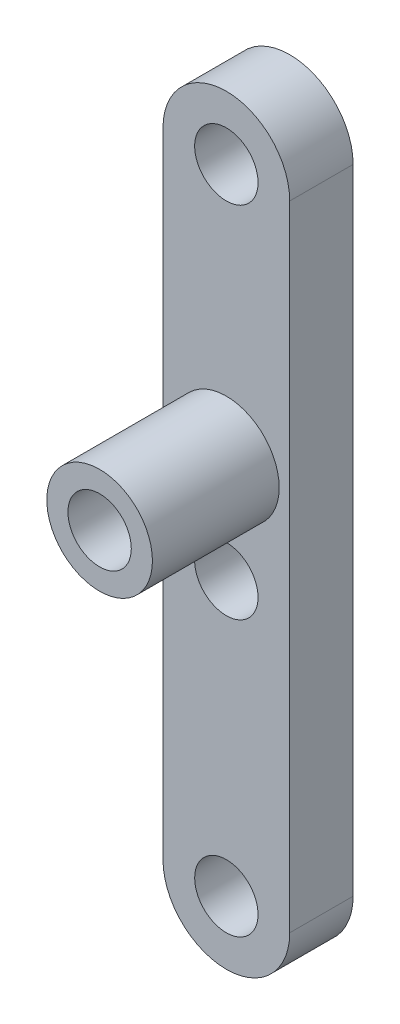
ISO-10303-21;
HEADER;
FILE_DESCRIPTION(('STEP AP214'),'2;1');
FILE_NAME('part.step','',(''),(''),'','','');
FILE_SCHEMA(('AUTOMOTIVE_DESIGN { 1 0 10303 214 1 1 1 1 }'));
ENDSEC;
DATA;
#1=APPLICATION_CONTEXT('core data for automotive mechanical design processes');
#2=APPLICATION_PROTOCOL_DEFINITION('international standard','automotive_design',2000,#1);
#3=PRODUCT_CONTEXT('',#1,'mechanical');
#4=PRODUCT('Part','Part','',(#3));
#5=PRODUCT_RELATED_PRODUCT_CATEGORY('part','',(#4));
#6=PRODUCT_DEFINITION_FORMATION('','',#4);
#7=PRODUCT_DEFINITION_CONTEXT('part definition',#1,'design');
#8=PRODUCT_DEFINITION('design','',#6,#7);
#9=PRODUCT_DEFINITION_SHAPE('','',#8);
#10=(LENGTH_UNIT() NAMED_UNIT(*) SI_UNIT(.MILLI.,.METRE.));
#11=(NAMED_UNIT(*) PLANE_ANGLE_UNIT() SI_UNIT($,.RADIAN.));
#12=(NAMED_UNIT(*) SI_UNIT($,.STERADIAN.) SOLID_ANGLE_UNIT());
#13=UNCERTAINTY_MEASURE_WITH_UNIT(LENGTH_MEASURE(1.E-05),#10,'distance_accuracy_value','');
#14=(GEOMETRIC_REPRESENTATION_CONTEXT(3) GLOBAL_UNCERTAINTY_ASSIGNED_CONTEXT((#13)) GLOBAL_UNIT_ASSIGNED_CONTEXT((#10,
#11,#12)) REPRESENTATION_CONTEXT('',''));
#15=CARTESIAN_POINT('',(0.,0.,0.));
#16=DIRECTION('',(0.,0.,1.));
#17=DIRECTION('',(1.,0.,0.));
#18=AXIS2_PLACEMENT_3D('',#15,#16,#17);
#19=CARTESIAN_POINT('',(0.,-12.,6.));
#20=DIRECTION('',(0.,0.,-1.));
#21=DIRECTION('',(1.,0.,0.));
#22=AXIS2_PLACEMENT_3D('',#19,#20,#21);
#23=CYLINDRICAL_SURFACE('',#22,2.5);
#24=CARTESIAN_POINT('',(0.,-12.,6.));
#25=DIRECTION('',(0.,0.,1.));
#26=DIRECTION('',(1.,0.,0.));
#27=AXIS2_PLACEMENT_3D('',#24,#25,#26);
#28=CIRCLE('',#27,2.5);
#29=CARTESIAN_POINT('',(2.5,-12.,6.));
#30=VERTEX_POINT('',#29);
#31=EDGE_CURVE('E11',#30,#30,#28,.T.);
#32=ORIENTED_EDGE('',*,*,#31,.F.);
#33=EDGE_LOOP('',(#32));
#34=FACE_BOUND('',#33,.T.);
#35=CARTESIAN_POINT('',(0.,-12.,0.));
#36=DIRECTION('',(0.,0.,1.));
#37=DIRECTION('',(1.,0.,0.));
#38=AXIS2_PLACEMENT_3D('',#35,#36,#37);
#39=CIRCLE('',#38,2.5);
#40=CARTESIAN_POINT('',(2.5,-12.,0.));
#41=VERTEX_POINT('',#40);
#42=EDGE_CURVE('E46',#41,#41,#39,.T.);
#43=ORIENTED_EDGE('',*,*,#42,.T.);
#44=EDGE_LOOP('',(#43));
#45=FACE_BOUND('',#44,.T.);
#46=ADVANCED_FACE('F43',(#34,#45),#23,.T.);
#47=CARTESIAN_POINT('',(0.,-12.,6.));
#48=DIRECTION('',(0.,0.,-1.));
#49=DIRECTION('',(1.,0.,0.));
#50=AXIS2_PLACEMENT_3D('',#47,#48,#49);
#51=PLANE('',#50);
#52=CARTESIAN_POINT('',(0.,-12.,6.));
#53=DIRECTION('',(0.,0.,1.));
#54=DIRECTION('',(1.,0.,0.));
#55=AXIS2_PLACEMENT_3D('',#52,#53,#54);
#56=CIRCLE('',#55,1.5);
#57=CARTESIAN_POINT('',(1.5,-12.,6.));
#58=VERTEX_POINT('',#57);
#59=EDGE_CURVE('E53',#58,#58,#56,.T.);
#60=ORIENTED_EDGE('',*,*,#59,.F.);
#61=EDGE_LOOP('',(#60));
#62=FACE_BOUND('',#61,.T.);
#63=ORIENTED_EDGE('',*,*,#31,.T.);
#64=EDGE_LOOP('',(#63));
#65=FACE_BOUND('',#64,.T.);
#66=ADVANCED_FACE('F64',(#62,#65),#51,.F.);
#67=CARTESIAN_POINT('',(0.,-12.,0.));
#68=DIRECTION('',(0.,0.,-1.));
#69=DIRECTION('',(1.,0.,0.));
#70=AXIS2_PLACEMENT_3D('',#67,#68,#69);
#71=PLANE('',#70);
#72=CARTESIAN_POINT('',(0.,-12.,0.));
#73=DIRECTION('',(0.,0.,1.));
#74=DIRECTION('',(1.,0.,0.));
#75=AXIS2_PLACEMENT_3D('',#72,#73,#74);
#76=CIRCLE('',#75,1.5);
#77=CARTESIAN_POINT('',(1.5,-12.,0.));
#78=VERTEX_POINT('',#77);
#79=EDGE_CURVE('E55',#78,#78,#76,.T.);
#80=ORIENTED_EDGE('',*,*,#79,.T.);
#81=EDGE_LOOP('',(#80));
#82=FACE_BOUND('',#81,.T.);
#83=ORIENTED_EDGE('',*,*,#42,.F.);
#84=EDGE_LOOP('',(#83));
#85=FACE_BOUND('',#84,.T.);
#86=ADVANCED_FACE('F66',(#82,#85),#71,.T.);
#87=CARTESIAN_POINT('',(0.,-12.,6.));
#88=DIRECTION('',(0.,0.,-1.));
#89=DIRECTION('',(1.,0.,0.));
#90=AXIS2_PLACEMENT_3D('',#87,#88,#89);
#91=CYLINDRICAL_SURFACE('',#90,1.5);
#92=ORIENTED_EDGE('',*,*,#59,.T.);
#93=EDGE_LOOP('',(#92));
#94=FACE_BOUND('',#93,.T.);
#95=ORIENTED_EDGE('',*,*,#79,.F.);
#96=EDGE_LOOP('',(#95));
#97=FACE_BOUND('',#96,.T.);
#98=ADVANCED_FACE('F61',(#94,#97),#91,.F.);
#99=CLOSED_SHELL('',(#46,#66,#86,#98));
#100=MANIFOLD_SOLID_BREP('B2',#99);
#101=CARTESIAN_POINT('',(0.,0.,-3.));
#102=DIRECTION('',(0.,0.,-1.));
#103=DIRECTION('',(1.,0.,0.));
#104=AXIS2_PLACEMENT_3D('',#101,#102,#103);
#105=PLANE('',#104);
#106=CARTESIAN_POINT('',(0.,-17.,-3.));
#107=DIRECTION('',(0.,0.,1.));
#108=DIRECTION('',(1.,0.,0.));
#109=AXIS2_PLACEMENT_3D('',#106,#107,#108);
#110=CIRCLE('',#109,1.5);
#111=CARTESIAN_POINT('',(1.5,-17.,-3.));
#112=VERTEX_POINT('',#111);
#113=EDGE_CURVE('E190',#112,#112,#110,.T.);
#114=ORIENTED_EDGE('',*,*,#113,.T.);
#115=EDGE_LOOP('',(#114));
#116=FACE_BOUND('',#115,.T.);
#117=CARTESIAN_POINT('',(0.,0.,-3.));
#118=DIRECTION('',(0.,0.,1.));
#119=DIRECTION('',(1.,0.,0.));
#120=AXIS2_PLACEMENT_3D('',#117,#118,#119);
#121=CIRCLE('',#120,1.5);
#122=CARTESIAN_POINT('',(1.5,0.,-3.));
#123=VERTEX_POINT('',#122);
#124=EDGE_CURVE('E173',#123,#123,#121,.T.);
#125=ORIENTED_EDGE('',*,*,#124,.T.);
#126=EDGE_LOOP('',(#125));
#127=FACE_BOUND('',#126,.T.);
#128=CARTESIAN_POINT('',(0.,0.,-3.));
#129=DIRECTION('',(0.,0.,1.));
#130=DIRECTION('',(1.,0.,0.));
#131=AXIS2_PLACEMENT_3D('',#128,#129,#130);
#132=CIRCLE('',#131,3.);
#133=CARTESIAN_POINT('',(3.,0.,-3.));
#134=VERTEX_POINT('',#133);
#135=CARTESIAN_POINT('',(-3.,0.,-3.));
#136=VERTEX_POINT('',#135);
#137=EDGE_CURVE('E161',#134,#136,#132,.T.);
#138=ORIENTED_EDGE('',*,*,#137,.F.);
#139=DIRECTION('',(0.,1.,0.));
#140=VECTOR('',#139,1.);
#141=CARTESIAN_POINT('',(3.,0.,-3.));
#142=LINE('',#141,#140);
#143=CARTESIAN_POINT('',(3.,-30.,-3.));
#144=VERTEX_POINT('',#143);
#145=EDGE_CURVE('E164',#144,#134,#142,.T.);
#146=ORIENTED_EDGE('',*,*,#145,.F.);
#147=CARTESIAN_POINT('',(0.,-30.,-3.));
#148=DIRECTION('',(0.,0.,1.));
#149=DIRECTION('',(-1.,0.,0.));
#150=AXIS2_PLACEMENT_3D('',#147,#148,#149);
#151=CIRCLE('',#150,3.);
#152=CARTESIAN_POINT('',(-3.,-30.,-3.));
#153=VERTEX_POINT('',#152);
#154=EDGE_CURVE('E152',#153,#144,#151,.T.);
#155=ORIENTED_EDGE('',*,*,#154,.F.);
#156=DIRECTION('',(0.,-1.,0.));
#157=VECTOR('',#156,1.);
#158=CARTESIAN_POINT('',(-3.,0.,-3.));
#159=LINE('',#158,#157);
#160=EDGE_CURVE('E157',#136,#153,#159,.T.);
#161=ORIENTED_EDGE('',*,*,#160,.F.);
#162=EDGE_LOOP('',(#138,#146,#155,#161));
#163=FACE_BOUND('',#162,.T.);
#164=CARTESIAN_POINT('',(0.,-30.,-3.));
#165=DIRECTION('',(0.,0.,1.));
#166=DIRECTION('',(-1.,0.,0.));
#167=AXIS2_PLACEMENT_3D('',#164,#165,#166);
#168=CIRCLE('',#167,1.5);
#169=CARTESIAN_POINT('',(-1.5,-30.,-3.));
#170=VERTEX_POINT('',#169);
#171=EDGE_CURVE('E184',#170,#170,#168,.T.);
#172=ORIENTED_EDGE('',*,*,#171,.T.);
#173=EDGE_LOOP('',(#172));
#174=FACE_BOUND('',#173,.T.);
#175=CARTESIAN_POINT('',(0.,-12.,-3.));
#176=DIRECTION('',(0.,0.,1.));
#177=DIRECTION('',(1.,0.,0.));
#178=AXIS2_PLACEMENT_3D('',#175,#176,#177);
#179=CIRCLE('',#178,1.5);
#180=CARTESIAN_POINT('',(1.5,-12.,-3.));
#181=VERTEX_POINT('',#180);
#182=EDGE_CURVE('E196',#181,#181,#179,.T.);
#183=ORIENTED_EDGE('',*,*,#182,.T.);
#184=EDGE_LOOP('',(#183));
#185=FACE_BOUND('',#184,.T.);
#186=ADVANCED_FACE('F105',(#116,#127,#163,#174,#185),#105,.T.);
#187=CARTESIAN_POINT('',(0.,0.,0.));
#188=DIRECTION('',(0.,0.,-1.));
#189=DIRECTION('',(1.,0.,0.));
#190=AXIS2_PLACEMENT_3D('',#187,#188,#189);
#191=PLANE('',#190);
#192=CARTESIAN_POINT('',(0.,0.,0.));
#193=DIRECTION('',(0.,0.,1.));
#194=DIRECTION('',(1.,0.,0.));
#195=AXIS2_PLACEMENT_3D('',#192,#193,#194);
#196=CIRCLE('',#195,3.);
#197=CARTESIAN_POINT('',(3.,0.,0.));
#198=VERTEX_POINT('',#197);
#199=CARTESIAN_POINT('',(-3.,0.,0.));
#200=VERTEX_POINT('',#199);
#201=EDGE_CURVE('E169',#198,#200,#196,.T.);
#202=ORIENTED_EDGE('',*,*,#201,.T.);
#203=DIRECTION('',(0.,-1.,0.));
#204=VECTOR('',#203,1.);
#205=CARTESIAN_POINT('',(-3.,0.,0.));
#206=LINE('',#205,#204);
#207=CARTESIAN_POINT('',(-3.,-30.,0.));
#208=VERTEX_POINT('',#207);
#209=EDGE_CURVE('E172',#200,#208,#206,.T.);
#210=ORIENTED_EDGE('',*,*,#209,.T.);
#211=CARTESIAN_POINT('',(0.,-30.,0.));
#212=DIRECTION('',(0.,0.,1.));
#213=DIRECTION('',(-1.,0.,0.));
#214=AXIS2_PLACEMENT_3D('',#211,#212,#213);
#215=CIRCLE('',#214,3.);
#216=CARTESIAN_POINT('',(3.,-30.,0.));
#217=VERTEX_POINT('',#216);
#218=EDGE_CURVE('E155',#208,#217,#215,.T.);
#219=ORIENTED_EDGE('',*,*,#218,.T.);
#220=DIRECTION('',(0.,1.,0.));
#221=VECTOR('',#220,1.);
#222=CARTESIAN_POINT('',(3.,0.,0.));
#223=LINE('',#222,#221);
#224=EDGE_CURVE('E176',#217,#198,#223,.T.);
#225=ORIENTED_EDGE('',*,*,#224,.T.);
#226=EDGE_LOOP('',(#202,#210,#219,#225));
#227=FACE_BOUND('',#226,.T.);
#228=CARTESIAN_POINT('',(0.,0.,0.));
#229=DIRECTION('',(0.,0.,1.));
#230=DIRECTION('',(1.,0.,0.));
#231=AXIS2_PLACEMENT_3D('',#228,#229,#230);
#232=CIRCLE('',#231,1.5);
#233=CARTESIAN_POINT('',(1.5,0.,0.));
#234=VERTEX_POINT('',#233);
#235=EDGE_CURVE('E181',#234,#234,#232,.T.);
#236=ORIENTED_EDGE('',*,*,#235,.F.);
#237=EDGE_LOOP('',(#236));
#238=FACE_BOUND('',#237,.T.);
#239=CARTESIAN_POINT('',(0.,-30.,0.));
#240=DIRECTION('',(0.,0.,1.));
#241=DIRECTION('',(-1.,0.,0.));
#242=AXIS2_PLACEMENT_3D('',#239,#240,#241);
#243=CIRCLE('',#242,1.5);
#244=CARTESIAN_POINT('',(-1.5,-30.,0.));
#245=VERTEX_POINT('',#244);
#246=EDGE_CURVE('E187',#245,#245,#243,.T.);
#247=ORIENTED_EDGE('',*,*,#246,.F.);
#248=EDGE_LOOP('',(#247));
#249=FACE_BOUND('',#248,.T.);
#250=CARTESIAN_POINT('',(0.,-17.,0.));
#251=DIRECTION('',(0.,0.,1.));
#252=DIRECTION('',(1.,0.,0.));
#253=AXIS2_PLACEMENT_3D('',#250,#251,#252);
#254=CIRCLE('',#253,1.5);
#255=CARTESIAN_POINT('',(1.5,-17.,0.));
#256=VERTEX_POINT('',#255);
#257=EDGE_CURVE('E193',#256,#256,#254,.T.);
#258=ORIENTED_EDGE('',*,*,#257,.F.);
#259=EDGE_LOOP('',(#258));
#260=FACE_BOUND('',#259,.T.);
#261=CARTESIAN_POINT('',(0.,-12.,0.));
#262=DIRECTION('',(0.,0.,1.));
#263=DIRECTION('',(1.,0.,0.));
#264=AXIS2_PLACEMENT_3D('',#261,#262,#263);
#265=CIRCLE('',#264,1.5);
#266=CARTESIAN_POINT('',(1.5,-12.,0.));
#267=VERTEX_POINT('',#266);
#268=EDGE_CURVE('E199',#267,#267,#265,.T.);
#269=ORIENTED_EDGE('',*,*,#268,.F.);
#270=EDGE_LOOP('',(#269));
#271=FACE_BOUND('',#270,.T.);
#272=ADVANCED_FACE('F213',(#227,#238,#249,#260,#271),#191,.F.);
#273=CARTESIAN_POINT('',(0.,0.,-3.));
#274=DIRECTION('',(0.,0.,1.));
#275=DIRECTION('',(-1.,0.,0.));
#276=AXIS2_PLACEMENT_3D('',#273,#274,#275);
#277=CYLINDRICAL_SURFACE('',#276,3.);
#278=ORIENTED_EDGE('',*,*,#201,.F.);
#279=DIRECTION('',(0.,0.,1.));
#280=VECTOR('',#279,1.);
#281=CARTESIAN_POINT('',(3.,0.,-3.));
#282=LINE('',#281,#280);
#283=EDGE_CURVE('E122',#134,#198,#282,.T.);
#284=ORIENTED_EDGE('',*,*,#283,.F.);
#285=ORIENTED_EDGE('',*,*,#137,.T.);
#286=DIRECTION('',(0.,0.,1.));
#287=VECTOR('',#286,1.);
#288=CARTESIAN_POINT('',(-3.,0.,-3.));
#289=LINE('',#288,#287);
#290=EDGE_CURVE('E41',#136,#200,#289,.T.);
#291=ORIENTED_EDGE('',*,*,#290,.T.);
#292=EDGE_LOOP('',(#278,#284,#285,#291));
#293=FACE_BOUND('',#292,.T.);
#294=ADVANCED_FACE('F107',(#293),#277,.T.);
#295=CARTESIAN_POINT('',(-3.,0.,-3.));
#296=DIRECTION('',(1.,0.,0.));
#297=DIRECTION('',(0.,1.,0.));
#298=AXIS2_PLACEMENT_3D('',#295,#296,#297);
#299=PLANE('',#298);
#300=ORIENTED_EDGE('',*,*,#209,.F.);
#301=ORIENTED_EDGE('',*,*,#290,.F.);
#302=ORIENTED_EDGE('',*,*,#160,.T.);
#303=DIRECTION('',(0.,0.,1.));
#304=VECTOR('',#303,1.);
#305=CARTESIAN_POINT('',(-3.,-30.,-3.));
#306=LINE('',#305,#304);
#307=EDGE_CURVE('E114',#153,#208,#306,.T.);
#308=ORIENTED_EDGE('',*,*,#307,.T.);
#309=EDGE_LOOP('',(#300,#301,#302,#308));
#310=FACE_BOUND('',#309,.T.);
#311=ADVANCED_FACE('F158',(#310),#299,.F.);
#312=CARTESIAN_POINT('',(0.,-30.,-3.));
#313=DIRECTION('',(0.,0.,1.));
#314=DIRECTION('',(-1.,0.,0.));
#315=AXIS2_PLACEMENT_3D('',#312,#313,#314);
#316=CYLINDRICAL_SURFACE('',#315,3.);
#317=ORIENTED_EDGE('',*,*,#218,.F.);
#318=ORIENTED_EDGE('',*,*,#307,.F.);
#319=ORIENTED_EDGE('',*,*,#154,.T.);
#320=DIRECTION('',(0.,0.,1.));
#321=VECTOR('',#320,1.);
#322=CARTESIAN_POINT('',(3.,-30.,-3.));
#323=LINE('',#322,#321);
#324=EDGE_CURVE('E138',#144,#217,#323,.T.);
#325=ORIENTED_EDGE('',*,*,#324,.T.);
#326=EDGE_LOOP('',(#317,#318,#319,#325));
#327=FACE_BOUND('',#326,.T.);
#328=ADVANCED_FACE('F150',(#327),#316,.T.);
#329=CARTESIAN_POINT('',(3.,0.,-3.));
#330=DIRECTION('',(-1.,0.,0.));
#331=DIRECTION('',(0.,-1.,0.));
#332=AXIS2_PLACEMENT_3D('',#329,#330,#331);
#333=PLANE('',#332);
#334=ORIENTED_EDGE('',*,*,#224,.F.);
#335=ORIENTED_EDGE('',*,*,#324,.F.);
#336=ORIENTED_EDGE('',*,*,#145,.T.);
#337=ORIENTED_EDGE('',*,*,#283,.T.);
#338=EDGE_LOOP('',(#334,#335,#336,#337));
#339=FACE_BOUND('',#338,.T.);
#340=ADVANCED_FACE('F225',(#339),#333,.F.);
#341=CARTESIAN_POINT('',(0.,0.,-3.));
#342=DIRECTION('',(0.,0.,1.));
#343=DIRECTION('',(-1.,0.,0.));
#344=AXIS2_PLACEMENT_3D('',#341,#342,#343);
#345=CYLINDRICAL_SURFACE('',#344,1.5);
#346=ORIENTED_EDGE('',*,*,#124,.F.);
#347=EDGE_LOOP('',(#346));
#348=FACE_BOUND('',#347,.T.);
#349=ORIENTED_EDGE('',*,*,#235,.T.);
#350=EDGE_LOOP('',(#349));
#351=FACE_BOUND('',#350,.T.);
#352=ADVANCED_FACE('F228',(#348,#351),#345,.F.);
#353=CARTESIAN_POINT('',(0.,-30.,-3.));
#354=DIRECTION('',(0.,0.,1.));
#355=DIRECTION('',(-1.,0.,0.));
#356=AXIS2_PLACEMENT_3D('',#353,#354,#355);
#357=CYLINDRICAL_SURFACE('',#356,1.5);
#358=ORIENTED_EDGE('',*,*,#171,.F.);
#359=EDGE_LOOP('',(#358));
#360=FACE_BOUND('',#359,.T.);
#361=ORIENTED_EDGE('',*,*,#246,.T.);
#362=EDGE_LOOP('',(#361));
#363=FACE_BOUND('',#362,.T.);
#364=ADVANCED_FACE('F249',(#360,#363),#357,.F.);
#365=CARTESIAN_POINT('',(0.,-17.,-3.));
#366=DIRECTION('',(0.,0.,1.));
#367=DIRECTION('',(-1.,0.,0.));
#368=AXIS2_PLACEMENT_3D('',#365,#366,#367);
#369=CYLINDRICAL_SURFACE('',#368,1.5);
#370=ORIENTED_EDGE('',*,*,#113,.F.);
#371=EDGE_LOOP('',(#370));
#372=FACE_BOUND('',#371,.T.);
#373=ORIENTED_EDGE('',*,*,#257,.T.);
#374=EDGE_LOOP('',(#373));
#375=FACE_BOUND('',#374,.T.);
#376=ADVANCED_FACE('F209',(#372,#375),#369,.F.);
#377=CARTESIAN_POINT('',(0.,-12.,-3.));
#378=DIRECTION('',(0.,0.,1.));
#379=DIRECTION('',(-1.,0.,0.));
#380=AXIS2_PLACEMENT_3D('',#377,#378,#379);
#381=CYLINDRICAL_SURFACE('',#380,1.5);
#382=ORIENTED_EDGE('',*,*,#182,.F.);
#383=EDGE_LOOP('',(#382));
#384=FACE_BOUND('',#383,.T.);
#385=ORIENTED_EDGE('',*,*,#268,.T.);
#386=EDGE_LOOP('',(#385));
#387=FACE_BOUND('',#386,.T.);
#388=ADVANCED_FACE('F206',(#384,#387),#381,.F.);
#389=CLOSED_SHELL('',(#186,#272,#294,#311,#328,#340,#352,#364,#376,#388));
#390=MANIFOLD_SOLID_BREP('B6',#389);
#391=ADVANCED_BREP_SHAPE_REPRESENTATION('',(#18,#100,#390),#14);
#392=SHAPE_DEFINITION_REPRESENTATION(#9,#391);
ENDSEC;
END-ISO-10303-21;
